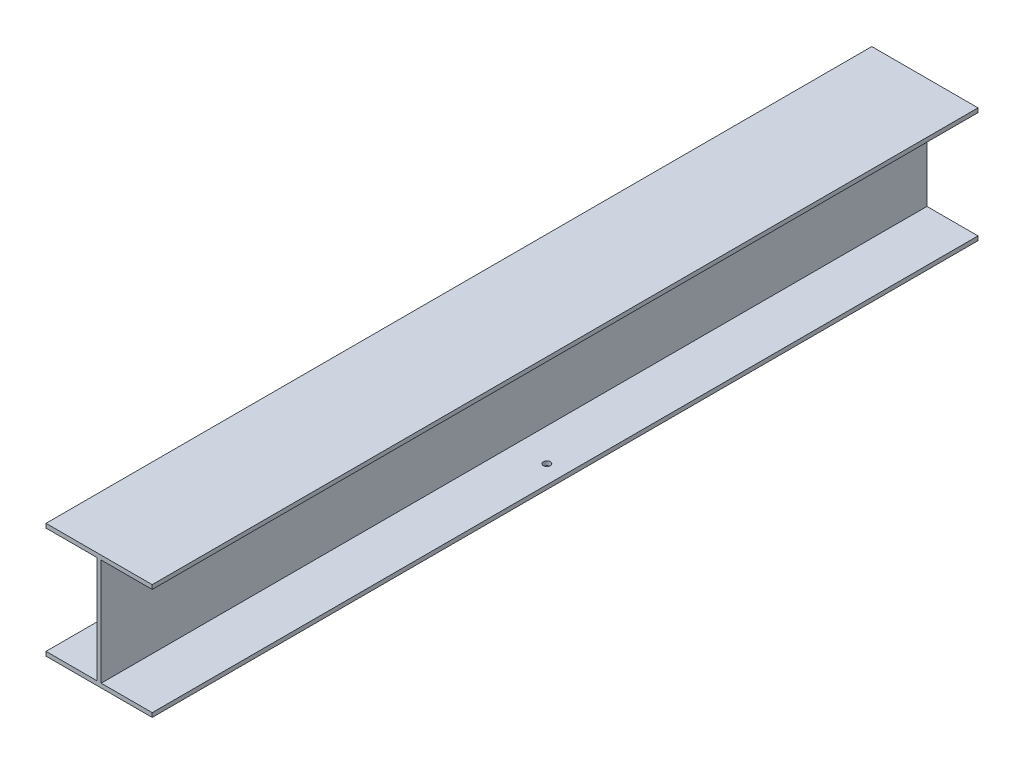
ISO-10303-21;
HEADER;
FILE_DESCRIPTION(('STEP AP214'),'2;1');
FILE_NAME('part.step','',(''),(''),'','','');
FILE_SCHEMA(('AUTOMOTIVE_DESIGN { 1 0 10303 214 1 1 1 1 }'));
ENDSEC;
DATA;
#1=APPLICATION_CONTEXT('core data for automotive mechanical design processes');
#2=APPLICATION_PROTOCOL_DEFINITION('international standard','automotive_design',2000,#1);
#3=PRODUCT_CONTEXT('',#1,'mechanical');
#4=PRODUCT('Part','Part','',(#3));
#5=PRODUCT_RELATED_PRODUCT_CATEGORY('part','',(#4));
#6=PRODUCT_DEFINITION_FORMATION('','',#4);
#7=PRODUCT_DEFINITION_CONTEXT('part definition',#1,'design');
#8=PRODUCT_DEFINITION('design','',#6,#7);
#9=PRODUCT_DEFINITION_SHAPE('','',#8);
#10=(LENGTH_UNIT() NAMED_UNIT(*) SI_UNIT(.MILLI.,.METRE.));
#11=(NAMED_UNIT(*) PLANE_ANGLE_UNIT() SI_UNIT($,.RADIAN.));
#12=(NAMED_UNIT(*) SI_UNIT($,.STERADIAN.) SOLID_ANGLE_UNIT());
#13=UNCERTAINTY_MEASURE_WITH_UNIT(LENGTH_MEASURE(1.E-05),#10,'distance_accuracy_value','');
#14=(GEOMETRIC_REPRESENTATION_CONTEXT(3) GLOBAL_UNCERTAINTY_ASSIGNED_CONTEXT((#13)) GLOBAL_UNIT_ASSIGNED_CONTEXT((#10,
#11,#12)) REPRESENTATION_CONTEXT('',''));
#15=CARTESIAN_POINT('',(0.,0.,0.));
#16=DIRECTION('',(0.,0.,1.));
#17=DIRECTION('',(1.,0.,0.));
#18=AXIS2_PLACEMENT_3D('',#15,#16,#17);
#19=CARTESIAN_POINT('',(0.,-76.55,1185.));
#20=DIRECTION('',(0.,1.,0.));
#21=DIRECTION('',(0.,0.,1.));
#22=AXIS2_PLACEMENT_3D('',#19,#20,#21);
#23=PLANE('',#22);
#24=CARTESIAN_POINT('',(50.,-76.55,592.50000000001));
#25=DIRECTION('',(0.,1.,0.));
#26=DIRECTION('',(0.,0.,1.));
#27=AXIS2_PLACEMENT_3D('',#24,#25,#26);
#28=CIRCLE('',#27,4.99999999999705);
#29=CARTESIAN_POINT('',(50.,-76.55,597.500000000007));
#30=VERTEX_POINT('',#29);
#31=EDGE_CURVE('E154',#30,#30,#28,.T.);
#32=ORIENTED_EDGE('',*,*,#31,.F.);
#33=EDGE_LOOP('',(#32));
#34=FACE_BOUND('',#33,.T.);
#35=DIRECTION('',(1.,0.,0.));
#36=VECTOR('',#35,1.);
#37=CARTESIAN_POINT('',(0.,-76.55,0.));
#38=LINE('',#37,#36);
#39=CARTESIAN_POINT('',(2.99999999999993,-76.55,0.));
#40=VERTEX_POINT('',#39);
#41=CARTESIAN_POINT('',(76.2,-76.55,0.));
#42=VERTEX_POINT('',#41);
#43=EDGE_CURVE('E150',#40,#42,#38,.T.);
#44=ORIENTED_EDGE('',*,*,#43,.F.);
#45=DIRECTION('',(0.,0.,-1.));
#46=VECTOR('',#45,1.);
#47=CARTESIAN_POINT('',(2.99999999999993,-76.55,1185.));
#48=LINE('',#47,#46);
#49=CARTESIAN_POINT('',(2.99999999999993,-76.55,1185.));
#50=VERTEX_POINT('',#49);
#51=EDGE_CURVE('E11',#50,#40,#48,.T.);
#52=ORIENTED_EDGE('',*,*,#51,.F.);
#53=DIRECTION('',(1.,0.,0.));
#54=VECTOR('',#53,1.);
#55=CARTESIAN_POINT('',(0.,-76.55,1185.));
#56=LINE('',#55,#54);
#57=CARTESIAN_POINT('',(76.2,-76.55,1185.));
#58=VERTEX_POINT('',#57);
#59=EDGE_CURVE('E180',#50,#58,#56,.T.);
#60=ORIENTED_EDGE('',*,*,#59,.T.);
#61=DIRECTION('',(0.,0.,-1.));
#62=VECTOR('',#61,1.);
#63=CARTESIAN_POINT('',(76.2,-76.55,1185.));
#64=LINE('',#63,#62);
#65=EDGE_CURVE('E98',#58,#42,#64,.T.);
#66=ORIENTED_EDGE('',*,*,#65,.T.);
#67=EDGE_LOOP('',(#44,#52,#60,#66));
#68=FACE_BOUND('',#67,.T.);
#69=ADVANCED_FACE('F35',(#34,#68),#23,.T.);
#70=CARTESIAN_POINT('',(2.99999999999994,0.,1185.));
#71=DIRECTION('',(1.,0.,0.));
#72=DIRECTION('',(0.,1.,0.));
#73=AXIS2_PLACEMENT_3D('',#70,#71,#72);
#74=PLANE('',#73);
#75=DIRECTION('',(0.,-1.,0.));
#76=VECTOR('',#75,1.);
#77=CARTESIAN_POINT('',(2.99999999999994,0.,0.));
#78=LINE('',#77,#76);
#79=CARTESIAN_POINT('',(2.99999999999994,76.55,0.));
#80=VERTEX_POINT('',#79);
#81=EDGE_CURVE('E153',#80,#40,#78,.T.);
#82=ORIENTED_EDGE('',*,*,#81,.F.);
#83=DIRECTION('',(0.,0.,-1.));
#84=VECTOR('',#83,1.);
#85=CARTESIAN_POINT('',(2.99999999999994,76.55,1185.));
#86=LINE('',#85,#84);
#87=CARTESIAN_POINT('',(2.99999999999994,76.55,1185.));
#88=VERTEX_POINT('',#87);
#89=EDGE_CURVE('E43',#88,#80,#86,.T.);
#90=ORIENTED_EDGE('',*,*,#89,.F.);
#91=DIRECTION('',(0.,-1.,0.));
#92=VECTOR('',#91,1.);
#93=CARTESIAN_POINT('',(2.99999999999994,0.,1185.));
#94=LINE('',#93,#92);
#95=EDGE_CURVE('E211',#88,#50,#94,.T.);
#96=ORIENTED_EDGE('',*,*,#95,.T.);
#97=ORIENTED_EDGE('',*,*,#51,.T.);
#98=EDGE_LOOP('',(#82,#90,#96,#97));
#99=FACE_BOUND('',#98,.T.);
#100=ADVANCED_FACE('F210',(#99),#74,.T.);
#101=CARTESIAN_POINT('',(0.,76.55,1185.));
#102=DIRECTION('',(0.,1.,0.));
#103=DIRECTION('',(0.,0.,1.));
#104=AXIS2_PLACEMENT_3D('',#101,#102,#103);
#105=PLANE('',#104);
#106=DIRECTION('',(1.,0.,0.));
#107=VECTOR('',#106,1.);
#108=CARTESIAN_POINT('',(0.,76.55,0.));
#109=LINE('',#108,#107);
#110=CARTESIAN_POINT('',(76.2,76.55,0.));
#111=VERTEX_POINT('',#110);
#112=EDGE_CURVE('E157',#80,#111,#109,.T.);
#113=ORIENTED_EDGE('',*,*,#112,.T.);
#114=DIRECTION('',(0.,0.,-1.));
#115=VECTOR('',#114,1.);
#116=CARTESIAN_POINT('',(76.2,76.55,1185.));
#117=LINE('',#116,#115);
#118=CARTESIAN_POINT('',(76.2,76.55,1185.));
#119=VERTEX_POINT('',#118);
#120=EDGE_CURVE('E196',#119,#111,#117,.T.);
#121=ORIENTED_EDGE('',*,*,#120,.F.);
#122=DIRECTION('',(1.,0.,0.));
#123=VECTOR('',#122,1.);
#124=CARTESIAN_POINT('',(0.,76.55,1185.));
#125=LINE('',#124,#123);
#126=EDGE_CURVE('E202',#88,#119,#125,.T.);
#127=ORIENTED_EDGE('',*,*,#126,.F.);
#128=ORIENTED_EDGE('',*,*,#89,.T.);
#129=EDGE_LOOP('',(#113,#121,#127,#128));
#130=FACE_BOUND('',#129,.T.);
#131=ADVANCED_FACE('F200',(#130),#105,.F.);
#132=CARTESIAN_POINT('',(76.2,0.,1185.));
#133=DIRECTION('',(1.,0.,0.));
#134=DIRECTION('',(0.,0.,-1.));
#135=AXIS2_PLACEMENT_3D('',#132,#133,#134);
#136=PLANE('',#135);
#137=DIRECTION('',(0.,-1.,0.));
#138=VECTOR('',#137,1.);
#139=CARTESIAN_POINT('',(76.2,0.,0.));
#140=LINE('',#139,#138);
#141=CARTESIAN_POINT('',(76.2,82.55,0.));
#142=VERTEX_POINT('',#141);
#143=EDGE_CURVE('E160',#142,#111,#140,.T.);
#144=ORIENTED_EDGE('',*,*,#143,.F.);
#145=DIRECTION('',(0.,0.,-1.));
#146=VECTOR('',#145,1.);
#147=CARTESIAN_POINT('',(76.2,82.55,1185.));
#148=LINE('',#147,#146);
#149=CARTESIAN_POINT('',(76.2,82.55,1185.));
#150=VERTEX_POINT('',#149);
#151=EDGE_CURVE('E194',#150,#142,#148,.T.);
#152=ORIENTED_EDGE('',*,*,#151,.F.);
#153=DIRECTION('',(0.,-1.,0.));
#154=VECTOR('',#153,1.);
#155=CARTESIAN_POINT('',(76.2,0.,1185.));
#156=LINE('',#155,#154);
#157=EDGE_CURVE('E221',#150,#119,#156,.T.);
#158=ORIENTED_EDGE('',*,*,#157,.T.);
#159=ORIENTED_EDGE('',*,*,#120,.T.);
#160=EDGE_LOOP('',(#144,#152,#158,#159));
#161=FACE_BOUND('',#160,.T.);
#162=ADVANCED_FACE('F256',(#161),#136,.T.);
#163=CARTESIAN_POINT('',(0.,82.55,1185.));
#164=DIRECTION('',(0.,1.,0.));
#165=DIRECTION('',(0.,0.,1.));
#166=AXIS2_PLACEMENT_3D('',#163,#164,#165);
#167=PLANE('',#166);
#168=DIRECTION('',(1.,0.,0.));
#169=VECTOR('',#168,1.);
#170=CARTESIAN_POINT('',(0.,82.55,0.));
#171=LINE('',#170,#169);
#172=CARTESIAN_POINT('',(-76.2,82.55,0.));
#173=VERTEX_POINT('',#172);
#174=EDGE_CURVE('E163',#173,#142,#171,.T.);
#175=ORIENTED_EDGE('',*,*,#174,.F.);
#176=DIRECTION('',(0.,0.,-1.));
#177=VECTOR('',#176,1.);
#178=CARTESIAN_POINT('',(-76.2,82.55,1185.));
#179=LINE('',#178,#177);
#180=CARTESIAN_POINT('',(-76.2,82.55,1185.));
#181=VERTEX_POINT('',#180);
#182=EDGE_CURVE('E192',#181,#173,#179,.T.);
#183=ORIENTED_EDGE('',*,*,#182,.F.);
#184=DIRECTION('',(1.,0.,0.));
#185=VECTOR('',#184,1.);
#186=CARTESIAN_POINT('',(0.,82.55,1185.));
#187=LINE('',#186,#185);
#188=EDGE_CURVE('E224',#181,#150,#187,.T.);
#189=ORIENTED_EDGE('',*,*,#188,.T.);
#190=ORIENTED_EDGE('',*,*,#151,.T.);
#191=EDGE_LOOP('',(#175,#183,#189,#190));
#192=FACE_BOUND('',#191,.T.);
#193=ADVANCED_FACE('F253',(#192),#167,.T.);
#194=CARTESIAN_POINT('',(-76.2,0.,1185.));
#195=DIRECTION('',(1.,0.,0.));
#196=DIRECTION('',(0.,0.,-1.));
#197=AXIS2_PLACEMENT_3D('',#194,#195,#196);
#198=PLANE('',#197);
#199=DIRECTION('',(0.,-1.,0.));
#200=VECTOR('',#199,1.);
#201=CARTESIAN_POINT('',(-76.2,0.,0.));
#202=LINE('',#201,#200);
#203=CARTESIAN_POINT('',(-76.2,76.55,0.));
#204=VERTEX_POINT('',#203);
#205=EDGE_CURVE('E166',#173,#204,#202,.T.);
#206=ORIENTED_EDGE('',*,*,#205,.T.);
#207=DIRECTION('',(0.,0.,-1.));
#208=VECTOR('',#207,1.);
#209=CARTESIAN_POINT('',(-76.2,76.55,1185.));
#210=LINE('',#209,#208);
#211=CARTESIAN_POINT('',(-76.2,76.55,1185.));
#212=VERTEX_POINT('',#211);
#213=EDGE_CURVE('E189',#212,#204,#210,.T.);
#214=ORIENTED_EDGE('',*,*,#213,.F.);
#215=DIRECTION('',(0.,-1.,0.));
#216=VECTOR('',#215,1.);
#217=CARTESIAN_POINT('',(-76.2,0.,1185.));
#218=LINE('',#217,#216);
#219=EDGE_CURVE('E227',#181,#212,#218,.T.);
#220=ORIENTED_EDGE('',*,*,#219,.F.);
#221=ORIENTED_EDGE('',*,*,#182,.T.);
#222=EDGE_LOOP('',(#206,#214,#220,#221));
#223=FACE_BOUND('',#222,.T.);
#224=ADVANCED_FACE('F249',(#223),#198,.F.);
#225=CARTESIAN_POINT('',(0.,76.55,1185.));
#226=DIRECTION('',(0.,1.,0.));
#227=DIRECTION('',(0.,0.,1.));
#228=AXIS2_PLACEMENT_3D('',#225,#226,#227);
#229=PLANE('',#228);
#230=DIRECTION('',(1.,0.,0.));
#231=VECTOR('',#230,1.);
#232=CARTESIAN_POINT('',(0.,76.55,0.));
#233=LINE('',#232,#231);
#234=CARTESIAN_POINT('',(-3.00000000000006,76.55,0.));
#235=VERTEX_POINT('',#234);
#236=EDGE_CURVE('E168',#204,#235,#233,.T.);
#237=ORIENTED_EDGE('',*,*,#236,.T.);
#238=DIRECTION('',(0.,0.,-1.));
#239=VECTOR('',#238,1.);
#240=CARTESIAN_POINT('',(-3.00000000000006,76.55,1185.));
#241=LINE('',#240,#239);
#242=CARTESIAN_POINT('',(-3.00000000000006,76.55,1185.));
#243=VERTEX_POINT('',#242);
#244=EDGE_CURVE('E186',#243,#235,#241,.T.);
#245=ORIENTED_EDGE('',*,*,#244,.F.);
#246=DIRECTION('',(1.,0.,0.));
#247=VECTOR('',#246,1.);
#248=CARTESIAN_POINT('',(0.,76.55,1185.));
#249=LINE('',#248,#247);
#250=EDGE_CURVE('E229',#212,#243,#249,.T.);
#251=ORIENTED_EDGE('',*,*,#250,.F.);
#252=ORIENTED_EDGE('',*,*,#213,.T.);
#253=EDGE_LOOP('',(#237,#245,#251,#252));
#254=FACE_BOUND('',#253,.T.);
#255=ADVANCED_FACE('F245',(#254),#229,.F.);
#256=CARTESIAN_POINT('',(-3.00000000000006,0.,1185.));
#257=DIRECTION('',(1.,0.,0.));
#258=DIRECTION('',(0.,1.,0.));
#259=AXIS2_PLACEMENT_3D('',#256,#257,#258);
#260=PLANE('',#259);
#261=DIRECTION('',(0.,-1.,0.));
#262=VECTOR('',#261,1.);
#263=CARTESIAN_POINT('',(-3.00000000000006,0.,0.));
#264=LINE('',#263,#262);
#265=CARTESIAN_POINT('',(-3.00000000000006,-76.55,0.));
#266=VERTEX_POINT('',#265);
#267=EDGE_CURVE('E170',#235,#266,#264,.T.);
#268=ORIENTED_EDGE('',*,*,#267,.T.);
#269=DIRECTION('',(0.,0.,-1.));
#270=VECTOR('',#269,1.);
#271=CARTESIAN_POINT('',(-3.00000000000006,-76.55,1185.));
#272=LINE('',#271,#270);
#273=CARTESIAN_POINT('',(-3.00000000000006,-76.55,1185.));
#274=VERTEX_POINT('',#273);
#275=EDGE_CURVE('E184',#274,#266,#272,.T.);
#276=ORIENTED_EDGE('',*,*,#275,.F.);
#277=DIRECTION('',(0.,-1.,0.));
#278=VECTOR('',#277,1.);
#279=CARTESIAN_POINT('',(-3.00000000000006,0.,1185.));
#280=LINE('',#279,#278);
#281=EDGE_CURVE('E231',#243,#274,#280,.T.);
#282=ORIENTED_EDGE('',*,*,#281,.F.);
#283=ORIENTED_EDGE('',*,*,#244,.T.);
#284=EDGE_LOOP('',(#268,#276,#282,#283));
#285=FACE_BOUND('',#284,.T.);
#286=ADVANCED_FACE('F240',(#285),#260,.F.);
#287=CARTESIAN_POINT('',(0.,-76.55,1185.));
#288=DIRECTION('',(0.,1.,0.));
#289=DIRECTION('',(0.,0.,1.));
#290=AXIS2_PLACEMENT_3D('',#287,#288,#289);
#291=PLANE('',#290);
#292=CARTESIAN_POINT('',(-50.,-76.55,592.50000000001));
#293=DIRECTION('',(0.,1.,0.));
#294=DIRECTION('',(0.,0.,1.));
#295=AXIS2_PLACEMENT_3D('',#292,#293,#294);
#296=CIRCLE('',#295,4.99999999999705);
#297=CARTESIAN_POINT('',(-50.,-76.55,597.500000000007));
#298=VERTEX_POINT('',#297);
#299=EDGE_CURVE('E275',#298,#298,#296,.T.);
#300=ORIENTED_EDGE('',*,*,#299,.F.);
#301=EDGE_LOOP('',(#300));
#302=FACE_BOUND('',#301,.T.);
#303=DIRECTION('',(1.,0.,0.));
#304=VECTOR('',#303,1.);
#305=CARTESIAN_POINT('',(0.,-76.55,0.));
#306=LINE('',#305,#304);
#307=CARTESIAN_POINT('',(-76.2,-76.55,0.));
#308=VERTEX_POINT('',#307);
#309=EDGE_CURVE('E173',#308,#266,#306,.T.);
#310=ORIENTED_EDGE('',*,*,#309,.F.);
#311=DIRECTION('',(0.,0.,-1.));
#312=VECTOR('',#311,1.);
#313=CARTESIAN_POINT('',(-76.2,-76.55,1185.));
#314=LINE('',#313,#312);
#315=CARTESIAN_POINT('',(-76.2,-76.55,1185.));
#316=VERTEX_POINT('',#315);
#317=EDGE_CURVE('E142',#316,#308,#314,.T.);
#318=ORIENTED_EDGE('',*,*,#317,.F.);
#319=DIRECTION('',(1.,0.,0.));
#320=VECTOR('',#319,1.);
#321=CARTESIAN_POINT('',(0.,-76.55,1185.));
#322=LINE('',#321,#320);
#323=EDGE_CURVE('E135',#316,#274,#322,.T.);
#324=ORIENTED_EDGE('',*,*,#323,.T.);
#325=ORIENTED_EDGE('',*,*,#275,.T.);
#326=EDGE_LOOP('',(#310,#318,#324,#325));
#327=FACE_BOUND('',#326,.T.);
#328=ADVANCED_FACE('F234',(#302,#327),#291,.T.);
#329=CARTESIAN_POINT('',(-76.2,0.,1185.));
#330=DIRECTION('',(1.,0.,0.));
#331=DIRECTION('',(0.,0.,-1.));
#332=AXIS2_PLACEMENT_3D('',#329,#330,#331);
#333=PLANE('',#332);
#334=DIRECTION('',(0.,-1.,0.));
#335=VECTOR('',#334,1.);
#336=CARTESIAN_POINT('',(-76.2,0.,0.));
#337=LINE('',#336,#335);
#338=CARTESIAN_POINT('',(-76.2,-82.55,0.));
#339=VERTEX_POINT('',#338);
#340=EDGE_CURVE('E141',#308,#339,#337,.T.);
#341=ORIENTED_EDGE('',*,*,#340,.T.);
#342=DIRECTION('',(0.,0.,-1.));
#343=VECTOR('',#342,1.);
#344=CARTESIAN_POINT('',(-76.2,-82.55,1185.));
#345=LINE('',#344,#343);
#346=CARTESIAN_POINT('',(-76.2,-82.55,1185.));
#347=VERTEX_POINT('',#346);
#348=EDGE_CURVE('E138',#347,#339,#345,.T.);
#349=ORIENTED_EDGE('',*,*,#348,.F.);
#350=DIRECTION('',(0.,-1.,0.));
#351=VECTOR('',#350,1.);
#352=CARTESIAN_POINT('',(-76.2,0.,1185.));
#353=LINE('',#352,#351);
#354=EDGE_CURVE('E129',#316,#347,#353,.T.);
#355=ORIENTED_EDGE('',*,*,#354,.F.);
#356=ORIENTED_EDGE('',*,*,#317,.T.);
#357=EDGE_LOOP('',(#341,#349,#355,#356));
#358=FACE_BOUND('',#357,.T.);
#359=ADVANCED_FACE('F139',(#358),#333,.F.);
#360=CARTESIAN_POINT('',(0.,-82.55,1185.));
#361=DIRECTION('',(0.,1.,0.));
#362=DIRECTION('',(0.,0.,1.));
#363=AXIS2_PLACEMENT_3D('',#360,#361,#362);
#364=PLANE('',#363);
#365=CARTESIAN_POINT('',(-50.,-82.55,592.50000000001));
#366=DIRECTION('',(0.,-1.,0.));
#367=DIRECTION('',(0.,0.,-1.));
#368=AXIS2_PLACEMENT_3D('',#365,#366,#367);
#369=CIRCLE('',#368,4.99999999999705);
#370=CARTESIAN_POINT('',(-50.,-82.55,587.500000000013));
#371=VERTEX_POINT('',#370);
#372=EDGE_CURVE('E279',#371,#371,#369,.T.);
#373=ORIENTED_EDGE('',*,*,#372,.F.);
#374=EDGE_LOOP('',(#373));
#375=FACE_BOUND('',#374,.T.);
#376=CARTESIAN_POINT('',(50.,-82.55,592.50000000001));
#377=DIRECTION('',(0.,-1.,0.));
#378=DIRECTION('',(0.,0.,-1.));
#379=AXIS2_PLACEMENT_3D('',#376,#377,#378);
#380=CIRCLE('',#379,4.99999999999705);
#381=CARTESIAN_POINT('',(50.,-82.55,587.500000000013));
#382=VERTEX_POINT('',#381);
#383=EDGE_CURVE('E273',#382,#382,#380,.T.);
#384=ORIENTED_EDGE('',*,*,#383,.F.);
#385=EDGE_LOOP('',(#384));
#386=FACE_BOUND('',#385,.T.);
#387=DIRECTION('',(1.,0.,0.));
#388=VECTOR('',#387,1.);
#389=CARTESIAN_POINT('',(0.,-82.55,0.));
#390=LINE('',#389,#388);
#391=CARTESIAN_POINT('',(76.2,-82.55,0.));
#392=VERTEX_POINT('',#391);
#393=EDGE_CURVE('E91',#339,#392,#390,.T.);
#394=ORIENTED_EDGE('',*,*,#393,.T.);
#395=DIRECTION('',(0.,0.,-1.));
#396=VECTOR('',#395,1.);
#397=CARTESIAN_POINT('',(76.2,-82.55,1185.));
#398=LINE('',#397,#396);
#399=CARTESIAN_POINT('',(76.2,-82.55,1185.));
#400=VERTEX_POINT('',#399);
#401=EDGE_CURVE('E143',#400,#392,#398,.T.);
#402=ORIENTED_EDGE('',*,*,#401,.F.);
#403=DIRECTION('',(1.,0.,0.));
#404=VECTOR('',#403,1.);
#405=CARTESIAN_POINT('',(0.,-82.55,1185.));
#406=LINE('',#405,#404);
#407=EDGE_CURVE('E133',#347,#400,#406,.T.);
#408=ORIENTED_EDGE('',*,*,#407,.F.);
#409=ORIENTED_EDGE('',*,*,#348,.T.);
#410=EDGE_LOOP('',(#394,#402,#408,#409));
#411=FACE_BOUND('',#410,.T.);
#412=ADVANCED_FACE('F145',(#375,#386,#411),#364,.F.);
#413=CARTESIAN_POINT('',(76.2,0.,1185.));
#414=DIRECTION('',(-1.,0.,0.));
#415=DIRECTION('',(0.,0.,1.));
#416=AXIS2_PLACEMENT_3D('',#413,#414,#415);
#417=PLANE('',#416);
#418=DIRECTION('',(0.,1.,0.));
#419=VECTOR('',#418,1.);
#420=CARTESIAN_POINT('',(76.2,0.,0.));
#421=LINE('',#420,#419);
#422=EDGE_CURVE('E178',#392,#42,#421,.T.);
#423=ORIENTED_EDGE('',*,*,#422,.T.);
#424=ORIENTED_EDGE('',*,*,#65,.F.);
#425=DIRECTION('',(0.,1.,0.));
#426=VECTOR('',#425,1.);
#427=CARTESIAN_POINT('',(76.2,0.,1185.));
#428=LINE('',#427,#426);
#429=EDGE_CURVE('E51',#400,#58,#428,.T.);
#430=ORIENTED_EDGE('',*,*,#429,.F.);
#431=ORIENTED_EDGE('',*,*,#401,.T.);
#432=EDGE_LOOP('',(#423,#424,#430,#431));
#433=FACE_BOUND('',#432,.T.);
#434=ADVANCED_FACE('F214',(#433),#417,.F.);
#435=CARTESIAN_POINT('',(0.,0.,1185.));
#436=DIRECTION('',(0.,0.,1.));
#437=DIRECTION('',(1.,0.,0.));
#438=AXIS2_PLACEMENT_3D('',#435,#436,#437);
#439=PLANE('',#438);
#440=ORIENTED_EDGE('',*,*,#59,.F.);
#441=ORIENTED_EDGE('',*,*,#95,.F.);
#442=ORIENTED_EDGE('',*,*,#126,.T.);
#443=ORIENTED_EDGE('',*,*,#157,.F.);
#444=ORIENTED_EDGE('',*,*,#188,.F.);
#445=ORIENTED_EDGE('',*,*,#219,.T.);
#446=ORIENTED_EDGE('',*,*,#250,.T.);
#447=ORIENTED_EDGE('',*,*,#281,.T.);
#448=ORIENTED_EDGE('',*,*,#323,.F.);
#449=ORIENTED_EDGE('',*,*,#354,.T.);
#450=ORIENTED_EDGE('',*,*,#407,.T.);
#451=ORIENTED_EDGE('',*,*,#429,.T.);
#452=EDGE_LOOP('',(#440,#441,#442,#443,#444,#445,#446,#447,#448,#449,#450,#451));
#453=FACE_BOUND('',#452,.T.);
#454=ADVANCED_FACE('F131',(#453),#439,.T.);
#455=CARTESIAN_POINT('',(0.,0.,0.));
#456=DIRECTION('',(0.,0.,1.));
#457=DIRECTION('',(1.,0.,0.));
#458=AXIS2_PLACEMENT_3D('',#455,#456,#457);
#459=PLANE('',#458);
#460=ORIENTED_EDGE('',*,*,#43,.T.);
#461=ORIENTED_EDGE('',*,*,#422,.F.);
#462=ORIENTED_EDGE('',*,*,#393,.F.);
#463=ORIENTED_EDGE('',*,*,#340,.F.);
#464=ORIENTED_EDGE('',*,*,#309,.T.);
#465=ORIENTED_EDGE('',*,*,#267,.F.);
#466=ORIENTED_EDGE('',*,*,#236,.F.);
#467=ORIENTED_EDGE('',*,*,#205,.F.);
#468=ORIENTED_EDGE('',*,*,#174,.T.);
#469=ORIENTED_EDGE('',*,*,#143,.T.);
#470=ORIENTED_EDGE('',*,*,#112,.F.);
#471=ORIENTED_EDGE('',*,*,#81,.T.);
#472=EDGE_LOOP('',(#460,#461,#462,#463,#464,#465,#466,#467,#468,#469,#470,#471));
#473=FACE_BOUND('',#472,.T.);
#474=ADVANCED_FACE('F208',(#473),#459,.F.);
#475=CARTESIAN_POINT('',(50.,-62.55,592.50000000001));
#476=DIRECTION('',(0.,-1.,0.));
#477=DIRECTION('',(0.,0.,-1.));
#478=AXIS2_PLACEMENT_3D('',#475,#476,#477);
#479=CYLINDRICAL_SURFACE('',#478,4.99999999999705);
#480=ORIENTED_EDGE('',*,*,#31,.T.);
#481=EDGE_LOOP('',(#480));
#482=FACE_BOUND('',#481,.T.);
#483=ORIENTED_EDGE('',*,*,#383,.T.);
#484=EDGE_LOOP('',(#483));
#485=FACE_BOUND('',#484,.T.);
#486=ADVANCED_FACE('F349',(#482,#485),#479,.F.);
#487=CARTESIAN_POINT('',(-50.,-62.55,592.50000000001));
#488=DIRECTION('',(0.,-1.,0.));
#489=DIRECTION('',(0.,0.,-1.));
#490=AXIS2_PLACEMENT_3D('',#487,#488,#489);
#491=CYLINDRICAL_SURFACE('',#490,4.99999999999705);
#492=ORIENTED_EDGE('',*,*,#299,.T.);
#493=EDGE_LOOP('',(#492));
#494=FACE_BOUND('',#493,.T.);
#495=ORIENTED_EDGE('',*,*,#372,.T.);
#496=EDGE_LOOP('',(#495));
#497=FACE_BOUND('',#496,.T.);
#498=ADVANCED_FACE('F285',(#494,#497),#491,.F.);
#499=CLOSED_SHELL('',(#69,#100,#131,#162,#193,#224,#255,#286,#328,#359,#412,#434,#454,#474,#486,#498));
#500=MANIFOLD_SOLID_BREP('B2',#499);
#501=ADVANCED_BREP_SHAPE_REPRESENTATION('',(#18,#500),#14);
#502=SHAPE_DEFINITION_REPRESENTATION(#9,#501);
ENDSEC;
END-ISO-10303-21;
